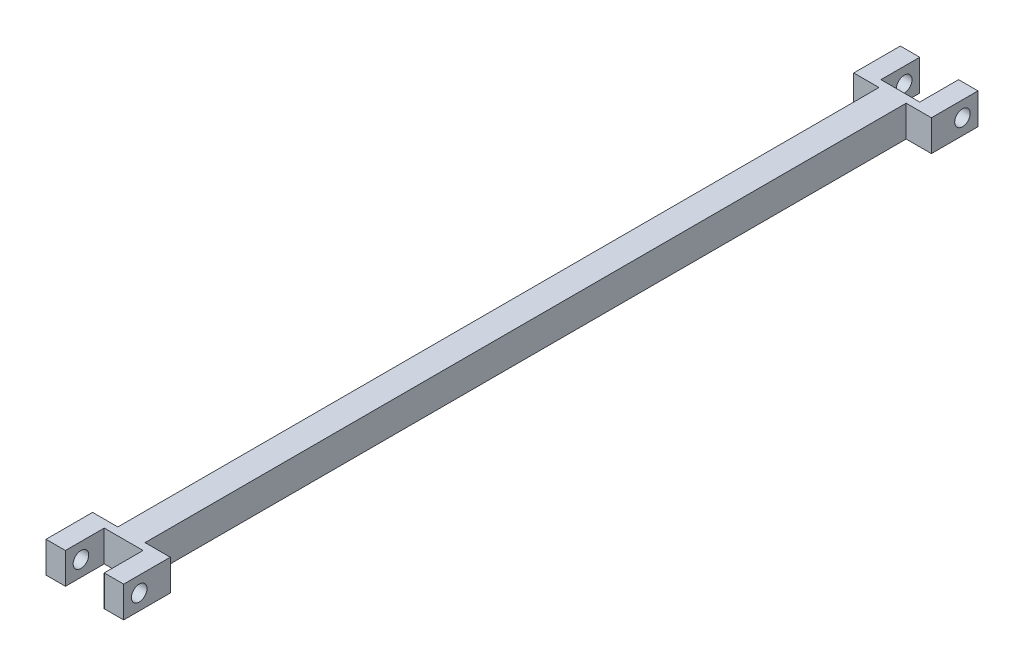
ISO-10303-21;
HEADER;
FILE_DESCRIPTION(('STEP AP214'),'2;1');
FILE_NAME('part.step','',(''),(''),'','','');
FILE_SCHEMA(('AUTOMOTIVE_DESIGN { 1 0 10303 214 1 1 1 1 }'));
ENDSEC;
DATA;
#1=APPLICATION_CONTEXT('core data for automotive mechanical design processes');
#2=APPLICATION_PROTOCOL_DEFINITION('international standard','automotive_design',2000,#1);
#3=PRODUCT_CONTEXT('',#1,'mechanical');
#4=PRODUCT('Part','Part','',(#3));
#5=PRODUCT_RELATED_PRODUCT_CATEGORY('part','',(#4));
#6=PRODUCT_DEFINITION_FORMATION('','',#4);
#7=PRODUCT_DEFINITION_CONTEXT('part definition',#1,'design');
#8=PRODUCT_DEFINITION('design','',#6,#7);
#9=PRODUCT_DEFINITION_SHAPE('','',#8);
#10=(LENGTH_UNIT() NAMED_UNIT(*) SI_UNIT(.MILLI.,.METRE.));
#11=(NAMED_UNIT(*) PLANE_ANGLE_UNIT() SI_UNIT($,.RADIAN.));
#12=(NAMED_UNIT(*) SI_UNIT($,.STERADIAN.) SOLID_ANGLE_UNIT());
#13=UNCERTAINTY_MEASURE_WITH_UNIT(LENGTH_MEASURE(1.E-05),#10,'distance_accuracy_value','');
#14=(GEOMETRIC_REPRESENTATION_CONTEXT(3) GLOBAL_UNCERTAINTY_ASSIGNED_CONTEXT((#13)) GLOBAL_UNIT_ASSIGNED_CONTEXT((#10,
#11,#12)) REPRESENTATION_CONTEXT('',''));
#15=CARTESIAN_POINT('',(0.,0.,0.));
#16=DIRECTION('',(0.,0.,1.));
#17=DIRECTION('',(1.,0.,0.));
#18=AXIS2_PLACEMENT_3D('',#15,#16,#17);
#19=CARTESIAN_POINT('',(0.,0.,-10.));
#20=DIRECTION('',(0.,0.,-1.));
#21=DIRECTION('',(1.,0.,0.));
#22=AXIS2_PLACEMENT_3D('',#19,#20,#21);
#23=PLANE('',#22);
#24=DIRECTION('',(0.,-1.,0.));
#25=VECTOR('',#24,1.);
#26=CARTESIAN_POINT('',(42.5,40.,-10.));
#27=LINE('',#26,#25);
#28=CARTESIAN_POINT('',(42.5,40.,-10.));
#29=VERTEX_POINT('',#28);
#30=CARTESIAN_POINT('',(42.5,0.,-10.));
#31=VERTEX_POINT('',#30);
#32=EDGE_CURVE('E193',#29,#31,#27,.T.);
#33=ORIENTED_EDGE('',*,*,#32,.T.);
#34=DIRECTION('',(1.,0.,0.));
#35=VECTOR('',#34,1.);
#36=CARTESIAN_POINT('',(-32.5,0.,-10.));
#37=LINE('',#36,#35);
#38=CARTESIAN_POINT('',(-7.50000000000001,0.,-10.));
#39=VERTEX_POINT('',#38);
#40=EDGE_CURVE('E231',#39,#31,#37,.T.);
#41=ORIENTED_EDGE('',*,*,#40,.F.);
#42=DIRECTION('',(0.,1.,0.));
#43=VECTOR('',#42,1.);
#44=CARTESIAN_POINT('',(-7.50000000000001,40.,-10.));
#45=LINE('',#44,#43);
#46=CARTESIAN_POINT('',(-7.50000000000001,40.,-10.));
#47=VERTEX_POINT('',#46);
#48=EDGE_CURVE('E210',#39,#47,#45,.T.);
#49=ORIENTED_EDGE('',*,*,#48,.T.);
#50=DIRECTION('',(-1.,0.,0.));
#51=VECTOR('',#50,1.);
#52=CARTESIAN_POINT('',(-32.5,40.,-10.));
#53=LINE('',#52,#51);
#54=EDGE_CURVE('E50',#29,#47,#53,.T.);
#55=ORIENTED_EDGE('',*,*,#54,.F.);
#56=EDGE_LOOP('',(#33,#41,#49,#55));
#57=FACE_BOUND('',#56,.T.);
#58=ADVANCED_FACE('F33',(#57),#23,.T.);
#59=CARTESIAN_POINT('',(0.,0.,990.));
#60=DIRECTION('',(0.,0.,1.));
#61=DIRECTION('',(1.,0.,0.));
#62=AXIS2_PLACEMENT_3D('',#59,#60,#61);
#63=PLANE('',#62);
#64=DIRECTION('',(1.,0.,0.));
#65=VECTOR('',#64,1.);
#66=CARTESIAN_POINT('',(-32.5,0.,990.));
#67=LINE('',#66,#65);
#68=CARTESIAN_POINT('',(-7.50000000000001,0.,990.));
#69=VERTEX_POINT('',#68);
#70=CARTESIAN_POINT('',(42.5,0.,990.));
#71=VERTEX_POINT('',#70);
#72=EDGE_CURVE('E296',#69,#71,#67,.T.);
#73=ORIENTED_EDGE('',*,*,#72,.T.);
#74=DIRECTION('',(0.,-1.,0.));
#75=VECTOR('',#74,1.);
#76=CARTESIAN_POINT('',(42.5,40.,990.));
#77=LINE('',#76,#75);
#78=CARTESIAN_POINT('',(42.5,40.,990.));
#79=VERTEX_POINT('',#78);
#80=EDGE_CURVE('E58',#79,#71,#77,.T.);
#81=ORIENTED_EDGE('',*,*,#80,.F.);
#82=DIRECTION('',(-1.,0.,0.));
#83=VECTOR('',#82,1.);
#84=CARTESIAN_POINT('',(-32.5,40.,990.));
#85=LINE('',#84,#83);
#86=CARTESIAN_POINT('',(-7.50000000000001,40.,990.));
#87=VERTEX_POINT('',#86);
#88=EDGE_CURVE('E298',#79,#87,#85,.T.);
#89=ORIENTED_EDGE('',*,*,#88,.T.);
#90=DIRECTION('',(0.,1.,0.));
#91=VECTOR('',#90,1.);
#92=CARTESIAN_POINT('',(-7.50000000000001,40.,990.));
#93=LINE('',#92,#91);
#94=EDGE_CURVE('E276',#69,#87,#93,.T.);
#95=ORIENTED_EDGE('',*,*,#94,.F.);
#96=EDGE_LOOP('',(#73,#81,#89,#95));
#97=FACE_BOUND('',#96,.T.);
#98=ADVANCED_FACE('F414',(#97),#63,.T.);
#99=CARTESIAN_POINT('',(0.,0.,980.));
#100=DIRECTION('',(1.,0.,0.));
#101=DIRECTION('',(0.,1.,0.));
#102=AXIS2_PLACEMENT_3D('',#99,#100,#101);
#103=PLANE('',#102);
#104=DIRECTION('',(0.,-1.,0.));
#105=VECTOR('',#104,1.);
#106=CARTESIAN_POINT('',(0.,0.,0.));
#107=LINE('',#106,#105);
#108=CARTESIAN_POINT('',(0.,40.,0.));
#109=VERTEX_POINT('',#108);
#110=CARTESIAN_POINT('',(0.,0.,0.));
#111=VERTEX_POINT('',#110);
#112=EDGE_CURVE('E324',#109,#111,#107,.T.);
#113=ORIENTED_EDGE('',*,*,#112,.T.);
#114=DIRECTION('',(0.,0.,-1.));
#115=VECTOR('',#114,1.);
#116=CARTESIAN_POINT('',(0.,0.,980.));
#117=LINE('',#116,#115);
#118=CARTESIAN_POINT('',(0.,0.,980.));
#119=VERTEX_POINT('',#118);
#120=EDGE_CURVE('E11',#119,#111,#117,.T.);
#121=ORIENTED_EDGE('',*,*,#120,.F.);
#122=DIRECTION('',(0.,-1.,0.));
#123=VECTOR('',#122,1.);
#124=CARTESIAN_POINT('',(0.,0.,980.));
#125=LINE('',#124,#123);
#126=CARTESIAN_POINT('',(0.,40.,980.));
#127=VERTEX_POINT('',#126);
#128=EDGE_CURVE('E325',#127,#119,#125,.T.);
#129=ORIENTED_EDGE('',*,*,#128,.F.);
#130=DIRECTION('',(0.,0.,-1.));
#131=VECTOR('',#130,1.);
#132=CARTESIAN_POINT('',(0.,40.,980.));
#133=LINE('',#132,#131);
#134=EDGE_CURVE('E332',#127,#109,#133,.T.);
#135=ORIENTED_EDGE('',*,*,#134,.T.);
#136=EDGE_LOOP('',(#113,#121,#129,#135));
#137=FACE_BOUND('',#136,.T.);
#138=ADVANCED_FACE('F35',(#137),#103,.F.);
#139=CARTESIAN_POINT('',(0.,0.,980.));
#140=DIRECTION('',(0.,1.,0.));
#141=DIRECTION('',(0.,0.,1.));
#142=AXIS2_PLACEMENT_3D('',#139,#140,#141);
#143=PLANE('',#142);
#144=ORIENTED_EDGE('',*,*,#120,.T.);
#145=DIRECTION('',(1.,0.,0.));
#146=VECTOR('',#145,1.);
#147=CARTESIAN_POINT('',(-32.5,0.,0.));
#148=LINE('',#147,#146);
#149=CARTESIAN_POINT('',(-32.5,0.,0.));
#150=VERTEX_POINT('',#149);
#151=EDGE_CURVE('E232',#150,#111,#148,.T.);
#152=ORIENTED_EDGE('',*,*,#151,.F.);
#153=DIRECTION('',(0.,0.,1.));
#154=VECTOR('',#153,1.);
#155=CARTESIAN_POINT('',(-32.5,0.,-10.));
#156=LINE('',#155,#154);
#157=CARTESIAN_POINT('',(-32.5,0.,-60.));
#158=VERTEX_POINT('',#157);
#159=EDGE_CURVE('E235',#158,#150,#156,.T.);
#160=ORIENTED_EDGE('',*,*,#159,.F.);
#161=DIRECTION('',(1.,0.,0.));
#162=VECTOR('',#161,1.);
#163=CARTESIAN_POINT('',(-32.5,0.,-60.));
#164=LINE('',#163,#162);
#165=CARTESIAN_POINT('',(-7.50000000000001,0.,-60.));
#166=VERTEX_POINT('',#165);
#167=EDGE_CURVE('E217',#158,#166,#164,.T.);
#168=ORIENTED_EDGE('',*,*,#167,.T.);
#169=DIRECTION('',(0.,0.,1.));
#170=VECTOR('',#169,1.);
#171=CARTESIAN_POINT('',(-7.50000000000001,0.,-60.));
#172=LINE('',#171,#170);
#173=EDGE_CURVE('E223',#166,#39,#172,.T.);
#174=ORIENTED_EDGE('',*,*,#173,.T.);
#175=ORIENTED_EDGE('',*,*,#40,.T.);
#176=DIRECTION('',(0.,0.,1.));
#177=VECTOR('',#176,1.);
#178=CARTESIAN_POINT('',(42.5,0.,-60.));
#179=LINE('',#178,#177);
#180=CARTESIAN_POINT('',(42.5,0.,-60.));
#181=VERTEX_POINT('',#180);
#182=EDGE_CURVE('E208',#181,#31,#179,.T.);
#183=ORIENTED_EDGE('',*,*,#182,.F.);
#184=DIRECTION('',(1.,0.,0.));
#185=VECTOR('',#184,1.);
#186=CARTESIAN_POINT('',(42.5,0.,-60.));
#187=LINE('',#186,#185);
#188=CARTESIAN_POINT('',(67.5,0.,-60.));
#189=VERTEX_POINT('',#188);
#190=EDGE_CURVE('E197',#181,#189,#187,.T.);
#191=ORIENTED_EDGE('',*,*,#190,.T.);
#192=DIRECTION('',(0.,0.,1.));
#193=VECTOR('',#192,1.);
#194=CARTESIAN_POINT('',(67.5,0.,-10.));
#195=LINE('',#194,#193);
#196=CARTESIAN_POINT('',(67.5,0.,0.));
#197=VERTEX_POINT('',#196);
#198=EDGE_CURVE('E183',#189,#197,#195,.T.);
#199=ORIENTED_EDGE('',*,*,#198,.T.);
#200=CARTESIAN_POINT('',(35.,0.,0.));
#201=VERTEX_POINT('',#200);
#202=EDGE_CURVE('E242',#201,#197,#148,.T.);
#203=ORIENTED_EDGE('',*,*,#202,.F.);
#204=DIRECTION('',(0.,0.,-1.));
#205=VECTOR('',#204,1.);
#206=CARTESIAN_POINT('',(35.,0.,980.));
#207=LINE('',#206,#205);
#208=CARTESIAN_POINT('',(35.,0.,980.));
#209=VERTEX_POINT('',#208);
#210=EDGE_CURVE('E42',#209,#201,#207,.T.);
#211=ORIENTED_EDGE('',*,*,#210,.F.);
#212=DIRECTION('',(1.,0.,0.));
#213=VECTOR('',#212,1.);
#214=CARTESIAN_POINT('',(-32.5,0.,980.));
#215=LINE('',#214,#213);
#216=CARTESIAN_POINT('',(67.5,0.,980.));
#217=VERTEX_POINT('',#216);
#218=EDGE_CURVE('E304',#209,#217,#215,.T.);
#219=ORIENTED_EDGE('',*,*,#218,.T.);
#220=DIRECTION('',(0.,0.,-1.));
#221=VECTOR('',#220,1.);
#222=CARTESIAN_POINT('',(67.5,0.,990.));
#223=LINE('',#222,#221);
#224=CARTESIAN_POINT('',(67.5,0.,1040.));
#225=VERTEX_POINT('',#224);
#226=EDGE_CURVE('E318',#225,#217,#223,.T.);
#227=ORIENTED_EDGE('',*,*,#226,.F.);
#228=DIRECTION('',(1.,0.,0.));
#229=VECTOR('',#228,1.);
#230=CARTESIAN_POINT('',(42.5,0.,1040.));
#231=LINE('',#230,#229);
#232=CARTESIAN_POINT('',(42.5,0.,1040.));
#233=VERTEX_POINT('',#232);
#234=EDGE_CURVE('E263',#233,#225,#231,.T.);
#235=ORIENTED_EDGE('',*,*,#234,.F.);
#236=DIRECTION('',(0.,0.,-1.));
#237=VECTOR('',#236,1.);
#238=CARTESIAN_POINT('',(42.5,0.,1040.));
#239=LINE('',#238,#237);
#240=EDGE_CURVE('E269',#233,#71,#239,.T.);
#241=ORIENTED_EDGE('',*,*,#240,.T.);
#242=ORIENTED_EDGE('',*,*,#72,.F.);
#243=DIRECTION('',(0.,0.,-1.));
#244=VECTOR('',#243,1.);
#245=CARTESIAN_POINT('',(-7.50000000000001,0.,1040.));
#246=LINE('',#245,#244);
#247=CARTESIAN_POINT('',(-7.50000000000001,0.,1040.));
#248=VERTEX_POINT('',#247);
#249=EDGE_CURVE('E292',#248,#69,#246,.T.);
#250=ORIENTED_EDGE('',*,*,#249,.F.);
#251=DIRECTION('',(1.,0.,0.));
#252=VECTOR('',#251,1.);
#253=CARTESIAN_POINT('',(-32.5,0.,1040.));
#254=LINE('',#253,#252);
#255=CARTESIAN_POINT('',(-32.5,0.,1040.));
#256=VERTEX_POINT('',#255);
#257=EDGE_CURVE('E283',#256,#248,#254,.T.);
#258=ORIENTED_EDGE('',*,*,#257,.F.);
#259=DIRECTION('',(0.,0.,-1.));
#260=VECTOR('',#259,1.);
#261=CARTESIAN_POINT('',(-32.5,0.,990.));
#262=LINE('',#261,#260);
#263=CARTESIAN_POINT('',(-32.5,0.,980.));
#264=VERTEX_POINT('',#263);
#265=EDGE_CURVE('E321',#256,#264,#262,.T.);
#266=ORIENTED_EDGE('',*,*,#265,.T.);
#267=EDGE_CURVE('E305',#264,#119,#215,.T.);
#268=ORIENTED_EDGE('',*,*,#267,.T.);
#269=EDGE_LOOP('',(#144,#152,#160,#168,#174,#175,#183,#191,#199,#203,#211,#219,#227,#235,#241,
#242,#250,#258,#266,#268));
#270=FACE_BOUND('',#269,.T.);
#271=ADVANCED_FACE('F377',(#270),#143,.F.);
#272=CARTESIAN_POINT('',(35.,0.,980.));
#273=DIRECTION('',(-1.,0.,0.));
#274=DIRECTION('',(0.,-1.,0.));
#275=AXIS2_PLACEMENT_3D('',#272,#273,#274);
#276=PLANE('',#275);
#277=DIRECTION('',(0.,1.,0.));
#278=VECTOR('',#277,1.);
#279=CARTESIAN_POINT('',(35.,0.,0.));
#280=LINE('',#279,#278);
#281=CARTESIAN_POINT('',(35.,40.,0.));
#282=VERTEX_POINT('',#281);
#283=EDGE_CURVE('E329',#201,#282,#280,.T.);
#284=ORIENTED_EDGE('',*,*,#283,.T.);
#285=DIRECTION('',(0.,0.,-1.));
#286=VECTOR('',#285,1.);
#287=CARTESIAN_POINT('',(35.,40.,980.));
#288=LINE('',#287,#286);
#289=CARTESIAN_POINT('',(35.,40.,980.));
#290=VERTEX_POINT('',#289);
#291=EDGE_CURVE('E339',#290,#282,#288,.T.);
#292=ORIENTED_EDGE('',*,*,#291,.F.);
#293=DIRECTION('',(0.,1.,0.));
#294=VECTOR('',#293,1.);
#295=CARTESIAN_POINT('',(35.,0.,980.));
#296=LINE('',#295,#294);
#297=EDGE_CURVE('E328',#209,#290,#296,.T.);
#298=ORIENTED_EDGE('',*,*,#297,.F.);
#299=ORIENTED_EDGE('',*,*,#210,.T.);
#300=EDGE_LOOP('',(#284,#292,#298,#299));
#301=FACE_BOUND('',#300,.T.);
#302=ADVANCED_FACE('F372',(#301),#276,.F.);
#303=CARTESIAN_POINT('',(0.,40.,980.));
#304=DIRECTION('',(0.,-1.,0.));
#305=DIRECTION('',(0.,0.,-1.));
#306=AXIS2_PLACEMENT_3D('',#303,#304,#305);
#307=PLANE('',#306);
#308=ORIENTED_EDGE('',*,*,#291,.T.);
#309=DIRECTION('',(-1.,0.,0.));
#310=VECTOR('',#309,1.);
#311=CARTESIAN_POINT('',(-32.5,40.,0.));
#312=LINE('',#311,#310);
#313=CARTESIAN_POINT('',(67.5,40.,0.));
#314=VERTEX_POINT('',#313);
#315=EDGE_CURVE('E177',#314,#282,#312,.T.);
#316=ORIENTED_EDGE('',*,*,#315,.F.);
#317=DIRECTION('',(0.,0.,1.));
#318=VECTOR('',#317,1.);
#319=CARTESIAN_POINT('',(67.5,40.,-10.));
#320=LINE('',#319,#318);
#321=CARTESIAN_POINT('',(67.5,40.,-60.));
#322=VERTEX_POINT('',#321);
#323=EDGE_CURVE('E171',#322,#314,#320,.T.);
#324=ORIENTED_EDGE('',*,*,#323,.F.);
#325=DIRECTION('',(-1.,0.,0.));
#326=VECTOR('',#325,1.);
#327=CARTESIAN_POINT('',(67.5,40.,-60.));
#328=LINE('',#327,#326);
#329=CARTESIAN_POINT('',(42.5,40.,-60.));
#330=VERTEX_POINT('',#329);
#331=EDGE_CURVE('E175',#322,#330,#328,.T.);
#332=ORIENTED_EDGE('',*,*,#331,.T.);
#333=DIRECTION('',(0.,0.,1.));
#334=VECTOR('',#333,1.);
#335=CARTESIAN_POINT('',(42.5,40.,-60.));
#336=LINE('',#335,#334);
#337=EDGE_CURVE('E203',#330,#29,#336,.T.);
#338=ORIENTED_EDGE('',*,*,#337,.T.);
#339=ORIENTED_EDGE('',*,*,#54,.T.);
#340=DIRECTION('',(0.,0.,1.));
#341=VECTOR('',#340,1.);
#342=CARTESIAN_POINT('',(-7.50000000000001,40.,-60.));
#343=LINE('',#342,#341);
#344=CARTESIAN_POINT('',(-7.50000000000001,40.,-60.));
#345=VERTEX_POINT('',#344);
#346=EDGE_CURVE('E227',#345,#47,#343,.T.);
#347=ORIENTED_EDGE('',*,*,#346,.F.);
#348=DIRECTION('',(-1.,0.,0.));
#349=VECTOR('',#348,1.);
#350=CARTESIAN_POINT('',(-7.50000000000001,40.,-60.));
#351=LINE('',#350,#349);
#352=CARTESIAN_POINT('',(-32.5,40.,-60.));
#353=VERTEX_POINT('',#352);
#354=EDGE_CURVE('E211',#345,#353,#351,.T.);
#355=ORIENTED_EDGE('',*,*,#354,.T.);
#356=DIRECTION('',(0.,0.,1.));
#357=VECTOR('',#356,1.);
#358=CARTESIAN_POINT('',(-32.5,40.,-10.));
#359=LINE('',#358,#357);
#360=CARTESIAN_POINT('',(-32.5,40.,0.));
#361=VERTEX_POINT('',#360);
#362=EDGE_CURVE('E182',#353,#361,#359,.T.);
#363=ORIENTED_EDGE('',*,*,#362,.T.);
#364=EDGE_CURVE('E238',#109,#361,#312,.T.);
#365=ORIENTED_EDGE('',*,*,#364,.F.);
#366=ORIENTED_EDGE('',*,*,#134,.F.);
#367=DIRECTION('',(-1.,0.,0.));
#368=VECTOR('',#367,1.);
#369=CARTESIAN_POINT('',(-32.5,40.,980.));
#370=LINE('',#369,#368);
#371=CARTESIAN_POINT('',(-32.5,40.,980.));
#372=VERTEX_POINT('',#371);
#373=EDGE_CURVE('E310',#127,#372,#370,.T.);
#374=ORIENTED_EDGE('',*,*,#373,.T.);
#375=DIRECTION('',(0.,0.,-1.));
#376=VECTOR('',#375,1.);
#377=CARTESIAN_POINT('',(-32.5,40.,990.));
#378=LINE('',#377,#376);
#379=CARTESIAN_POINT('',(-32.5,40.,1040.));
#380=VERTEX_POINT('',#379);
#381=EDGE_CURVE('E301',#380,#372,#378,.T.);
#382=ORIENTED_EDGE('',*,*,#381,.F.);
#383=DIRECTION('',(-1.,0.,0.));
#384=VECTOR('',#383,1.);
#385=CARTESIAN_POINT('',(-7.50000000000001,40.,1040.));
#386=LINE('',#385,#384);
#387=CARTESIAN_POINT('',(-7.50000000000001,40.,1040.));
#388=VERTEX_POINT('',#387);
#389=EDGE_CURVE('E277',#388,#380,#386,.T.);
#390=ORIENTED_EDGE('',*,*,#389,.F.);
#391=DIRECTION('',(0.,0.,-1.));
#392=VECTOR('',#391,1.);
#393=CARTESIAN_POINT('',(-7.50000000000001,40.,1040.));
#394=LINE('',#393,#392);
#395=EDGE_CURVE('E287',#388,#87,#394,.T.);
#396=ORIENTED_EDGE('',*,*,#395,.T.);
#397=ORIENTED_EDGE('',*,*,#88,.F.);
#398=DIRECTION('',(0.,0.,-1.));
#399=VECTOR('',#398,1.);
#400=CARTESIAN_POINT('',(42.5,40.,1040.));
#401=LINE('',#400,#399);
#402=CARTESIAN_POINT('',(42.5,40.,1040.));
#403=VERTEX_POINT('',#402);
#404=EDGE_CURVE('E273',#403,#79,#401,.T.);
#405=ORIENTED_EDGE('',*,*,#404,.F.);
#406=DIRECTION('',(-1.,0.,0.));
#407=VECTOR('',#406,1.);
#408=CARTESIAN_POINT('',(67.5,40.,1040.));
#409=LINE('',#408,#407);
#410=CARTESIAN_POINT('',(67.5,40.,1040.));
#411=VERTEX_POINT('',#410);
#412=EDGE_CURVE('E258',#411,#403,#409,.T.);
#413=ORIENTED_EDGE('',*,*,#412,.F.);
#414=DIRECTION('',(0.,0.,-1.));
#415=VECTOR('',#414,1.);
#416=CARTESIAN_POINT('',(67.5,40.,990.));
#417=LINE('',#416,#415);
#418=CARTESIAN_POINT('',(67.5,40.,980.));
#419=VERTEX_POINT('',#418);
#420=EDGE_CURVE('E315',#411,#419,#417,.T.);
#421=ORIENTED_EDGE('',*,*,#420,.T.);
#422=EDGE_CURVE('E299',#419,#290,#370,.T.);
#423=ORIENTED_EDGE('',*,*,#422,.T.);
#424=EDGE_LOOP('',(#308,#316,#324,#332,#338,#339,#347,#355,#363,#365,#366,#374,#382,#390,#396,
#397,#405,#413,#421,#423));
#425=FACE_BOUND('',#424,.T.);
#426=ADVANCED_FACE('F174',(#425),#307,.F.);
#427=CARTESIAN_POINT('',(0.,0.,980.));
#428=DIRECTION('',(0.,0.,1.));
#429=DIRECTION('',(1.,0.,0.));
#430=AXIS2_PLACEMENT_3D('',#427,#428,#429);
#431=PLANE('',#430);
#432=ORIENTED_EDGE('',*,*,#373,.F.);
#433=ORIENTED_EDGE('',*,*,#128,.T.);
#434=ORIENTED_EDGE('',*,*,#267,.F.);
#435=DIRECTION('',(0.,-1.,0.));
#436=VECTOR('',#435,1.);
#437=CARTESIAN_POINT('',(-32.5,40.,980.));
#438=LINE('',#437,#436);
#439=EDGE_CURVE('E295',#372,#264,#438,.T.);
#440=ORIENTED_EDGE('',*,*,#439,.F.);
#441=EDGE_LOOP('',(#432,#433,#434,#440));
#442=FACE_BOUND('',#441,.T.);
#443=ADVANCED_FACE('F402',(#442),#431,.F.);
#444=ORIENTED_EDGE('',*,*,#218,.F.);
#445=ORIENTED_EDGE('',*,*,#297,.T.);
#446=ORIENTED_EDGE('',*,*,#422,.F.);
#447=DIRECTION('',(0.,1.,0.));
#448=VECTOR('',#447,1.);
#449=CARTESIAN_POINT('',(67.5,40.,980.));
#450=LINE('',#449,#448);
#451=EDGE_CURVE('E308',#217,#419,#450,.T.);
#452=ORIENTED_EDGE('',*,*,#451,.F.);
#453=EDGE_LOOP('',(#444,#445,#446,#452));
#454=FACE_BOUND('',#453,.T.);
#455=ADVANCED_FACE('F369',(#454),#431,.F.);
#456=CARTESIAN_POINT('',(-32.5,40.,990.));
#457=DIRECTION('',(1.,0.,0.));
#458=DIRECTION('',(0.,1.,0.));
#459=AXIS2_PLACEMENT_3D('',#456,#457,#458);
#460=PLANE('',#459);
#461=CARTESIAN_POINT('',(-32.5,20.,1020.));
#462=DIRECTION('',(1.,0.,0.));
#463=DIRECTION('',(0.,1.,0.));
#464=AXIS2_PLACEMENT_3D('',#461,#462,#463);
#465=CIRCLE('',#464,10.0000000000001);
#466=CARTESIAN_POINT('',(-32.5,30.0000000000001,1020.));
#467=VERTEX_POINT('',#466);
#468=EDGE_CURVE('E248',#467,#467,#465,.T.);
#469=ORIENTED_EDGE('',*,*,#468,.T.);
#470=EDGE_LOOP('',(#469));
#471=FACE_BOUND('',#470,.T.);
#472=ORIENTED_EDGE('',*,*,#439,.T.);
#473=ORIENTED_EDGE('',*,*,#265,.F.);
#474=DIRECTION('',(0.,-1.,0.));
#475=VECTOR('',#474,1.);
#476=CARTESIAN_POINT('',(-32.5,40.,1040.));
#477=LINE('',#476,#475);
#478=EDGE_CURVE('E280',#380,#256,#477,.T.);
#479=ORIENTED_EDGE('',*,*,#478,.F.);
#480=ORIENTED_EDGE('',*,*,#381,.T.);
#481=EDGE_LOOP('',(#472,#473,#479,#480));
#482=FACE_BOUND('',#481,.T.);
#483=ADVANCED_FACE('F360',(#471,#482),#460,.F.);
#484=CARTESIAN_POINT('',(67.5,40.,990.));
#485=DIRECTION('',(-1.,0.,0.));
#486=DIRECTION('',(0.,-1.,0.));
#487=AXIS2_PLACEMENT_3D('',#484,#485,#486);
#488=PLANE('',#487);
#489=CARTESIAN_POINT('',(67.5,20.,1020.));
#490=DIRECTION('',(-1.,0.,0.));
#491=DIRECTION('',(0.,-1.,0.));
#492=AXIS2_PLACEMENT_3D('',#489,#490,#491);
#493=CIRCLE('',#492,10.0000000000001);
#494=CARTESIAN_POINT('',(67.5,9.99999999999994,1020.));
#495=VERTEX_POINT('',#494);
#496=EDGE_CURVE('E255',#495,#495,#493,.T.);
#497=ORIENTED_EDGE('',*,*,#496,.T.);
#498=EDGE_LOOP('',(#497));
#499=FACE_BOUND('',#498,.T.);
#500=ORIENTED_EDGE('',*,*,#451,.T.);
#501=ORIENTED_EDGE('',*,*,#420,.F.);
#502=DIRECTION('',(0.,1.,0.));
#503=VECTOR('',#502,1.);
#504=CARTESIAN_POINT('',(67.5,0.,1040.));
#505=LINE('',#504,#503);
#506=EDGE_CURVE('E266',#225,#411,#505,.T.);
#507=ORIENTED_EDGE('',*,*,#506,.F.);
#508=ORIENTED_EDGE('',*,*,#226,.T.);
#509=EDGE_LOOP('',(#500,#501,#507,#508));
#510=FACE_BOUND('',#509,.T.);
#511=ADVANCED_FACE('F356',(#499,#510),#488,.F.);
#512=CARTESIAN_POINT('',(-7.50000000000001,40.,1040.));
#513=DIRECTION('',(-1.,0.,0.));
#514=DIRECTION('',(0.,0.,1.));
#515=AXIS2_PLACEMENT_3D('',#512,#513,#514);
#516=PLANE('',#515);
#517=CARTESIAN_POINT('',(-7.50000000000001,20.,1020.));
#518=DIRECTION('',(-1.,0.,0.));
#519=DIRECTION('',(0.,0.,1.));
#520=AXIS2_PLACEMENT_3D('',#517,#518,#519);
#521=CIRCLE('',#520,10.0000000000001);
#522=CARTESIAN_POINT('',(-7.50000000000001,20.,1030.));
#523=VERTEX_POINT('',#522);
#524=EDGE_CURVE('E252',#523,#523,#521,.T.);
#525=ORIENTED_EDGE('',*,*,#524,.T.);
#526=EDGE_LOOP('',(#525));
#527=FACE_BOUND('',#526,.T.);
#528=ORIENTED_EDGE('',*,*,#94,.T.);
#529=ORIENTED_EDGE('',*,*,#395,.F.);
#530=DIRECTION('',(0.,1.,0.));
#531=VECTOR('',#530,1.);
#532=CARTESIAN_POINT('',(-7.50000000000001,40.,1040.));
#533=LINE('',#532,#531);
#534=EDGE_CURVE('E285',#248,#388,#533,.T.);
#535=ORIENTED_EDGE('',*,*,#534,.F.);
#536=ORIENTED_EDGE('',*,*,#249,.T.);
#537=EDGE_LOOP('',(#528,#529,#535,#536));
#538=FACE_BOUND('',#537,.T.);
#539=ADVANCED_FACE('F359',(#527,#538),#516,.F.);
#540=CARTESIAN_POINT('',(0.,0.,1040.));
#541=DIRECTION('',(0.,0.,1.));
#542=DIRECTION('',(1.,0.,0.));
#543=AXIS2_PLACEMENT_3D('',#540,#541,#542);
#544=PLANE('',#543);
#545=ORIENTED_EDGE('',*,*,#389,.T.);
#546=ORIENTED_EDGE('',*,*,#478,.T.);
#547=ORIENTED_EDGE('',*,*,#257,.T.);
#548=ORIENTED_EDGE('',*,*,#534,.T.);
#549=EDGE_LOOP('',(#545,#546,#547,#548));
#550=FACE_BOUND('',#549,.T.);
#551=ADVANCED_FACE('F408',(#550),#544,.T.);
#552=CARTESIAN_POINT('',(42.5,40.,1040.));
#553=DIRECTION('',(1.,0.,0.));
#554=DIRECTION('',(0.,0.,-1.));
#555=AXIS2_PLACEMENT_3D('',#552,#553,#554);
#556=PLANE('',#555);
#557=CARTESIAN_POINT('',(42.5,20.,1020.));
#558=DIRECTION('',(1.,0.,0.));
#559=DIRECTION('',(0.,0.,-1.));
#560=AXIS2_PLACEMENT_3D('',#557,#558,#559);
#561=CIRCLE('',#560,10.0000000000001);
#562=CARTESIAN_POINT('',(42.5,20.,1010.));
#563=VERTEX_POINT('',#562);
#564=EDGE_CURVE('E251',#563,#563,#561,.T.);
#565=ORIENTED_EDGE('',*,*,#564,.T.);
#566=EDGE_LOOP('',(#565));
#567=FACE_BOUND('',#566,.T.);
#568=ORIENTED_EDGE('',*,*,#80,.T.);
#569=ORIENTED_EDGE('',*,*,#240,.F.);
#570=DIRECTION('',(0.,-1.,0.));
#571=VECTOR('',#570,1.);
#572=CARTESIAN_POINT('',(42.5,40.,1040.));
#573=LINE('',#572,#571);
#574=EDGE_CURVE('E261',#403,#233,#573,.T.);
#575=ORIENTED_EDGE('',*,*,#574,.F.);
#576=ORIENTED_EDGE('',*,*,#404,.T.);
#577=EDGE_LOOP('',(#568,#569,#575,#576));
#578=FACE_BOUND('',#577,.T.);
#579=ADVANCED_FACE('F345',(#567,#578),#556,.F.);
#580=CARTESIAN_POINT('',(0.,0.,1040.));
#581=DIRECTION('',(0.,0.,1.));
#582=DIRECTION('',(1.,0.,0.));
#583=AXIS2_PLACEMENT_3D('',#580,#581,#582);
#584=PLANE('',#583);
#585=ORIENTED_EDGE('',*,*,#412,.T.);
#586=ORIENTED_EDGE('',*,*,#574,.T.);
#587=ORIENTED_EDGE('',*,*,#234,.T.);
#588=ORIENTED_EDGE('',*,*,#506,.T.);
#589=EDGE_LOOP('',(#585,#586,#587,#588));
#590=FACE_BOUND('',#589,.T.);
#591=ADVANCED_FACE('F352',(#590),#584,.T.);
#592=CARTESIAN_POINT('',(-32.5,20.,1020.));
#593=DIRECTION('',(1.,0.,0.));
#594=DIRECTION('',(0.,1.,0.));
#595=AXIS2_PLACEMENT_3D('',#592,#593,#594);
#596=CYLINDRICAL_SURFACE('',#595,10.0000000000001);
#597=ORIENTED_EDGE('',*,*,#564,.F.);
#598=EDGE_LOOP('',(#597));
#599=FACE_BOUND('',#598,.T.);
#600=ORIENTED_EDGE('',*,*,#496,.F.);
#601=EDGE_LOOP('',(#600));
#602=FACE_BOUND('',#601,.T.);
#603=ADVANCED_FACE('F348',(#599,#602),#596,.F.);
#604=ORIENTED_EDGE('',*,*,#468,.F.);
#605=EDGE_LOOP('',(#604));
#606=FACE_BOUND('',#605,.T.);
#607=ORIENTED_EDGE('',*,*,#524,.F.);
#608=EDGE_LOOP('',(#607));
#609=FACE_BOUND('',#608,.T.);
#610=ADVANCED_FACE('F351',(#606,#609),#596,.F.);
#611=CARTESIAN_POINT('',(0.,0.,0.));
#612=DIRECTION('',(0.,0.,-1.));
#613=DIRECTION('',(1.,0.,0.));
#614=AXIS2_PLACEMENT_3D('',#611,#612,#613);
#615=PLANE('',#614);
#616=ORIENTED_EDGE('',*,*,#112,.F.);
#617=ORIENTED_EDGE('',*,*,#364,.T.);
#618=DIRECTION('',(0.,-1.,0.));
#619=VECTOR('',#618,1.);
#620=CARTESIAN_POINT('',(-32.5,40.,0.));
#621=LINE('',#620,#619);
#622=EDGE_CURVE('E229',#361,#150,#621,.T.);
#623=ORIENTED_EDGE('',*,*,#622,.T.);
#624=ORIENTED_EDGE('',*,*,#151,.T.);
#625=EDGE_LOOP('',(#616,#617,#623,#624));
#626=FACE_BOUND('',#625,.T.);
#627=ADVANCED_FACE('F435',(#626),#615,.F.);
#628=CARTESIAN_POINT('',(-32.5,40.,-10.));
#629=DIRECTION('',(-1.,0.,0.));
#630=DIRECTION('',(0.,-1.,0.));
#631=AXIS2_PLACEMENT_3D('',#628,#629,#630);
#632=PLANE('',#631);
#633=CARTESIAN_POINT('',(-32.5,20.,-40.));
#634=DIRECTION('',(-1.,0.,0.));
#635=DIRECTION('',(0.,1.,0.));
#636=AXIS2_PLACEMENT_3D('',#633,#634,#635);
#637=CIRCLE('',#636,10.0000000000001);
#638=CARTESIAN_POINT('',(-32.5,30.0000000000001,-40.));
#639=VERTEX_POINT('',#638);
#640=EDGE_CURVE('E446',#639,#639,#637,.T.);
#641=ORIENTED_EDGE('',*,*,#640,.F.);
#642=EDGE_LOOP('',(#641));
#643=FACE_BOUND('',#642,.T.);
#644=ORIENTED_EDGE('',*,*,#622,.F.);
#645=ORIENTED_EDGE('',*,*,#362,.F.);
#646=DIRECTION('',(0.,-1.,0.));
#647=VECTOR('',#646,1.);
#648=CARTESIAN_POINT('',(-32.5,40.,-60.));
#649=LINE('',#648,#647);
#650=EDGE_CURVE('E220',#353,#158,#649,.T.);
#651=ORIENTED_EDGE('',*,*,#650,.T.);
#652=ORIENTED_EDGE('',*,*,#159,.T.);
#653=EDGE_LOOP('',(#644,#645,#651,#652));
#654=FACE_BOUND('',#653,.T.);
#655=ADVANCED_FACE('F394',(#643,#654),#632,.T.);
#656=CARTESIAN_POINT('',(67.5,40.,-10.));
#657=DIRECTION('',(1.,0.,0.));
#658=DIRECTION('',(0.,1.,0.));
#659=AXIS2_PLACEMENT_3D('',#656,#657,#658);
#660=PLANE('',#659);
#661=CARTESIAN_POINT('',(67.5,20.,-40.));
#662=DIRECTION('',(1.,0.,0.));
#663=DIRECTION('',(0.,1.,0.));
#664=AXIS2_PLACEMENT_3D('',#661,#662,#663);
#665=CIRCLE('',#664,10.0000000000001);
#666=CARTESIAN_POINT('',(67.5,30.0000000000001,-40.));
#667=VERTEX_POINT('',#666);
#668=EDGE_CURVE('E206',#667,#667,#665,.F.);
#669=ORIENTED_EDGE('',*,*,#668,.T.);
#670=EDGE_LOOP('',(#669));
#671=FACE_BOUND('',#670,.T.);
#672=DIRECTION('',(0.,1.,0.));
#673=VECTOR('',#672,1.);
#674=CARTESIAN_POINT('',(67.5,40.,0.));
#675=LINE('',#674,#673);
#676=EDGE_CURVE('E240',#197,#314,#675,.T.);
#677=ORIENTED_EDGE('',*,*,#676,.F.);
#678=ORIENTED_EDGE('',*,*,#198,.F.);
#679=DIRECTION('',(0.,1.,0.));
#680=VECTOR('',#679,1.);
#681=CARTESIAN_POINT('',(67.5,0.,-60.));
#682=LINE('',#681,#680);
#683=EDGE_CURVE('E189',#189,#322,#682,.T.);
#684=ORIENTED_EDGE('',*,*,#683,.T.);
#685=ORIENTED_EDGE('',*,*,#323,.T.);
#686=EDGE_LOOP('',(#677,#678,#684,#685));
#687=FACE_BOUND('',#686,.T.);
#688=ADVANCED_FACE('F195',(#671,#687),#660,.T.);
#689=ORIENTED_EDGE('',*,*,#283,.F.);
#690=ORIENTED_EDGE('',*,*,#202,.T.);
#691=ORIENTED_EDGE('',*,*,#676,.T.);
#692=ORIENTED_EDGE('',*,*,#315,.T.);
#693=EDGE_LOOP('',(#689,#690,#691,#692));
#694=FACE_BOUND('',#693,.T.);
#695=ADVANCED_FACE('F375',(#694),#615,.F.);
#696=CARTESIAN_POINT('',(-7.50000000000001,40.,-60.));
#697=DIRECTION('',(1.,0.,0.));
#698=DIRECTION('',(0.,0.,-1.));
#699=AXIS2_PLACEMENT_3D('',#696,#697,#698);
#700=PLANE('',#699);
#701=CARTESIAN_POINT('',(-7.50000000000001,20.,-40.));
#702=DIRECTION('',(1.,0.,0.));
#703=DIRECTION('',(0.,0.,-1.));
#704=AXIS2_PLACEMENT_3D('',#701,#702,#703);
#705=CIRCLE('',#704,10.0000000000001);
#706=CARTESIAN_POINT('',(-7.50000000000001,20.,-50.0000000000001));
#707=VERTEX_POINT('',#706);
#708=EDGE_CURVE('E450',#707,#707,#705,.F.);
#709=ORIENTED_EDGE('',*,*,#708,.T.);
#710=EDGE_LOOP('',(#709));
#711=FACE_BOUND('',#710,.T.);
#712=ORIENTED_EDGE('',*,*,#48,.F.);
#713=ORIENTED_EDGE('',*,*,#173,.F.);
#714=DIRECTION('',(0.,1.,0.));
#715=VECTOR('',#714,1.);
#716=CARTESIAN_POINT('',(-7.50000000000001,40.,-60.));
#717=LINE('',#716,#715);
#718=EDGE_CURVE('E214',#166,#345,#717,.T.);
#719=ORIENTED_EDGE('',*,*,#718,.T.);
#720=ORIENTED_EDGE('',*,*,#346,.T.);
#721=EDGE_LOOP('',(#712,#713,#719,#720));
#722=FACE_BOUND('',#721,.T.);
#723=ADVANCED_FACE('F385',(#711,#722),#700,.T.);
#724=CARTESIAN_POINT('',(0.,0.,-60.));
#725=DIRECTION('',(0.,0.,-1.));
#726=DIRECTION('',(1.,0.,0.));
#727=AXIS2_PLACEMENT_3D('',#724,#725,#726);
#728=PLANE('',#727);
#729=ORIENTED_EDGE('',*,*,#354,.F.);
#730=ORIENTED_EDGE('',*,*,#718,.F.);
#731=ORIENTED_EDGE('',*,*,#167,.F.);
#732=ORIENTED_EDGE('',*,*,#650,.F.);
#733=EDGE_LOOP('',(#729,#730,#731,#732));
#734=FACE_BOUND('',#733,.T.);
#735=ADVANCED_FACE('F390',(#734),#728,.T.);
#736=CARTESIAN_POINT('',(42.5,40.,-60.));
#737=DIRECTION('',(-1.,0.,0.));
#738=DIRECTION('',(0.,0.,1.));
#739=AXIS2_PLACEMENT_3D('',#736,#737,#738);
#740=PLANE('',#739);
#741=CARTESIAN_POINT('',(42.5,20.,-40.));
#742=DIRECTION('',(-1.,0.,0.));
#743=DIRECTION('',(0.,0.,1.));
#744=AXIS2_PLACEMENT_3D('',#741,#742,#743);
#745=CIRCLE('',#744,10.0000000000001);
#746=CARTESIAN_POINT('',(42.5,20.,-29.9999999999999));
#747=VERTEX_POINT('',#746);
#748=EDGE_CURVE('E37',#747,#747,#745,.F.);
#749=ORIENTED_EDGE('',*,*,#748,.T.);
#750=EDGE_LOOP('',(#749));
#751=FACE_BOUND('',#750,.T.);
#752=ORIENTED_EDGE('',*,*,#32,.F.);
#753=ORIENTED_EDGE('',*,*,#337,.F.);
#754=DIRECTION('',(0.,-1.,0.));
#755=VECTOR('',#754,1.);
#756=CARTESIAN_POINT('',(42.5,40.,-60.));
#757=LINE('',#756,#755);
#758=EDGE_CURVE('E192',#330,#181,#757,.T.);
#759=ORIENTED_EDGE('',*,*,#758,.T.);
#760=ORIENTED_EDGE('',*,*,#182,.T.);
#761=EDGE_LOOP('',(#752,#753,#759,#760));
#762=FACE_BOUND('',#761,.T.);
#763=ADVANCED_FACE('F380',(#751,#762),#740,.T.);
#764=CARTESIAN_POINT('',(0.,0.,-60.));
#765=DIRECTION('',(0.,0.,-1.));
#766=DIRECTION('',(1.,0.,0.));
#767=AXIS2_PLACEMENT_3D('',#764,#765,#766);
#768=PLANE('',#767);
#769=ORIENTED_EDGE('',*,*,#331,.F.);
#770=ORIENTED_EDGE('',*,*,#683,.F.);
#771=ORIENTED_EDGE('',*,*,#190,.F.);
#772=ORIENTED_EDGE('',*,*,#758,.F.);
#773=EDGE_LOOP('',(#769,#770,#771,#772));
#774=FACE_BOUND('',#773,.T.);
#775=ADVANCED_FACE('F187',(#774),#768,.T.);
#776=CARTESIAN_POINT('',(-32.5,20.,-40.));
#777=DIRECTION('',(1.,0.,0.));
#778=DIRECTION('',(0.,1.,0.));
#779=AXIS2_PLACEMENT_3D('',#776,#777,#778);
#780=CYLINDRICAL_SURFACE('',#779,10.0000000000001);
#781=ORIENTED_EDGE('',*,*,#668,.F.);
#782=EDGE_LOOP('',(#781));
#783=FACE_BOUND('',#782,.T.);
#784=ORIENTED_EDGE('',*,*,#748,.F.);
#785=EDGE_LOOP('',(#784));
#786=FACE_BOUND('',#785,.T.);
#787=ADVANCED_FACE('F456',(#783,#786),#780,.F.);
#788=ORIENTED_EDGE('',*,*,#708,.F.);
#789=EDGE_LOOP('',(#788));
#790=FACE_BOUND('',#789,.T.);
#791=ORIENTED_EDGE('',*,*,#640,.T.);
#792=EDGE_LOOP('',(#791));
#793=FACE_BOUND('',#792,.T.);
#794=ADVANCED_FACE('F459',(#790,#793),#780,.F.);
#795=CLOSED_SHELL('',(#58,#98,#138,#271,#302,#426,#443,#455,#483,#511,#539,#551,#579,#591,#603,
#610,#627,#655,#688,#695,#723,#735,#763,#775,#787,#794));
#796=MANIFOLD_SOLID_BREP('B2',#795);
#797=ADVANCED_BREP_SHAPE_REPRESENTATION('',(#18,#796),#14);
#798=SHAPE_DEFINITION_REPRESENTATION(#9,#797);
ENDSEC;
END-ISO-10303-21;
